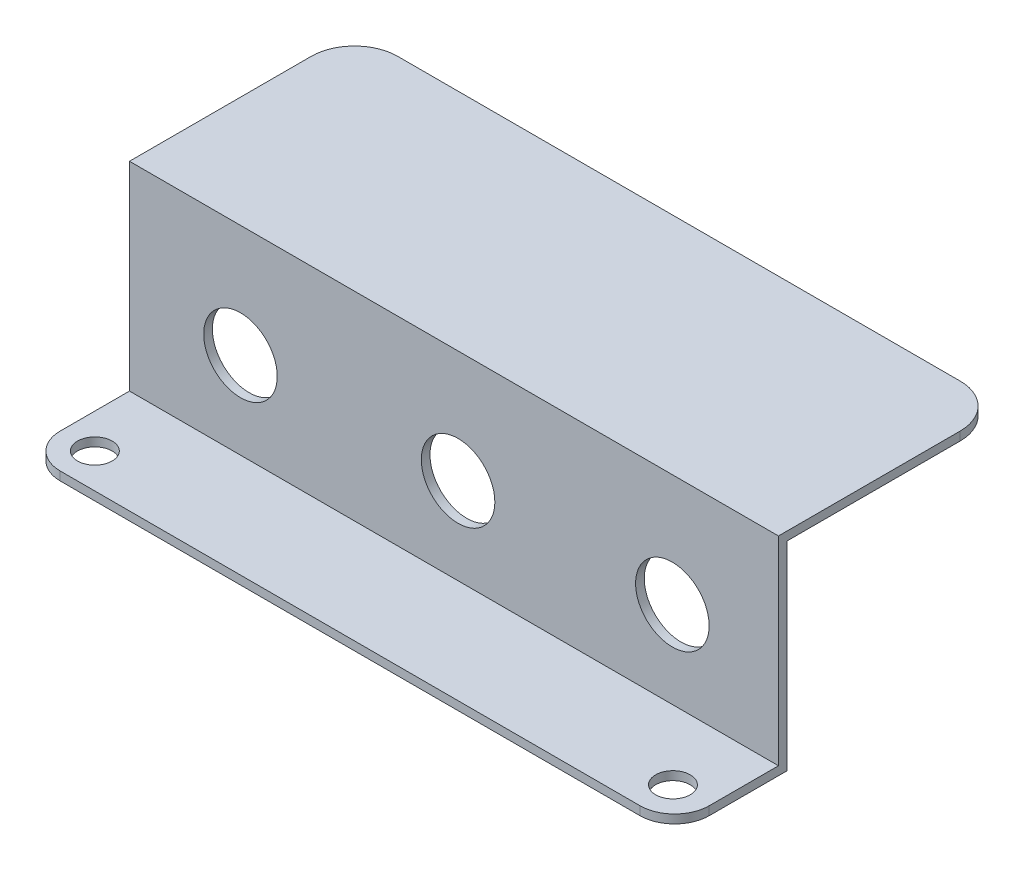
ISO-10303-21;
HEADER;
FILE_DESCRIPTION(('STEP AP214'),'2;1');
FILE_NAME('part.step','',(''),(''),'','','');
FILE_SCHEMA(('AUTOMOTIVE_DESIGN { 1 0 10303 214 1 1 1 1 }'));
ENDSEC;
DATA;
#1=APPLICATION_CONTEXT('core data for automotive mechanical design processes');
#2=APPLICATION_PROTOCOL_DEFINITION('international standard','automotive_design',2000,#1);
#3=PRODUCT_CONTEXT('',#1,'mechanical');
#4=PRODUCT('Part','Part','',(#3));
#5=PRODUCT_RELATED_PRODUCT_CATEGORY('part','',(#4));
#6=PRODUCT_DEFINITION_FORMATION('','',#4);
#7=PRODUCT_DEFINITION_CONTEXT('part definition',#1,'design');
#8=PRODUCT_DEFINITION('design','',#6,#7);
#9=PRODUCT_DEFINITION_SHAPE('','',#8);
#10=(LENGTH_UNIT() NAMED_UNIT(*) SI_UNIT(.MILLI.,.METRE.));
#11=(NAMED_UNIT(*) PLANE_ANGLE_UNIT() SI_UNIT($,.RADIAN.));
#12=(NAMED_UNIT(*) SI_UNIT($,.STERADIAN.) SOLID_ANGLE_UNIT());
#13=UNCERTAINTY_MEASURE_WITH_UNIT(LENGTH_MEASURE(1.E-05),#10,'distance_accuracy_value','');
#14=(GEOMETRIC_REPRESENTATION_CONTEXT(3) GLOBAL_UNCERTAINTY_ASSIGNED_CONTEXT((#13)) GLOBAL_UNIT_ASSIGNED_CONTEXT((#10,
#11,#12)) REPRESENTATION_CONTEXT('',''));
#15=CARTESIAN_POINT('',(0.,0.,0.));
#16=DIRECTION('',(0.,0.,1.));
#17=DIRECTION('',(1.,0.,0.));
#18=AXIS2_PLACEMENT_3D('',#15,#16,#17);
#19=CARTESIAN_POINT('',(0.,0.,16.));
#20=DIRECTION('',(0.,0.,1.));
#21=DIRECTION('',(1.,0.,0.));
#22=AXIS2_PLACEMENT_3D('',#19,#20,#21);
#23=PLANE('',#22);
#24=CARTESIAN_POINT('',(-37.1729743459487,-12.,16.));
#25=DIRECTION('',(0.,0.,1.));
#26=DIRECTION('',(1.,0.,0.));
#27=AXIS2_PLACEMENT_3D('',#24,#25,#26);
#28=CIRCLE('',#27,4.25000000000001);
#29=CARTESIAN_POINT('',(-32.9229743459487,-12.,16.));
#30=VERTEX_POINT('',#29);
#31=EDGE_CURVE('E313',#30,#30,#28,.T.);
#32=ORIENTED_EDGE('',*,*,#31,.F.);
#33=EDGE_LOOP('',(#32));
#34=FACE_BOUND('',#33,.T.);
#35=CARTESIAN_POINT('',(12.7381254762509,-12.,16.));
#36=DIRECTION('',(0.,0.,1.));
#37=DIRECTION('',(1.,0.,0.));
#38=AXIS2_PLACEMENT_3D('',#35,#36,#37);
#39=CIRCLE('',#38,4.25);
#40=CARTESIAN_POINT('',(16.9881254762509,-12.,16.));
#41=VERTEX_POINT('',#40);
#42=EDGE_CURVE('E312',#41,#41,#39,.T.);
#43=ORIENTED_EDGE('',*,*,#42,.F.);
#44=EDGE_LOOP('',(#43));
#45=FACE_BOUND('',#44,.T.);
#46=CARTESIAN_POINT('',(-12.026924053848,-12.,16.));
#47=DIRECTION('',(0.,0.,1.));
#48=DIRECTION('',(1.,0.,0.));
#49=AXIS2_PLACEMENT_3D('',#46,#47,#48);
#50=CIRCLE('',#49,4.25);
#51=CARTESIAN_POINT('',(-7.77692405384802,-12.,16.));
#52=VERTEX_POINT('',#51);
#53=EDGE_CURVE('E305',#52,#52,#50,.T.);
#54=ORIENTED_EDGE('',*,*,#53,.F.);
#55=EDGE_LOOP('',(#54));
#56=FACE_BOUND('',#55,.T.);
#57=DIRECTION('',(0.,-1.,0.));
#58=VECTOR('',#57,1.);
#59=CARTESIAN_POINT('',(-50.,1.,16.));
#60=LINE('',#59,#58);
#61=CARTESIAN_POINT('',(-50.,1.,16.));
#62=VERTEX_POINT('',#61);
#63=CARTESIAN_POINT('',(-50.,-22.,16.));
#64=VERTEX_POINT('',#63);
#65=EDGE_CURVE('E129',#62,#64,#60,.T.);
#66=ORIENTED_EDGE('',*,*,#65,.T.);
#67=DIRECTION('',(1.,0.,0.));
#68=VECTOR('',#67,1.);
#69=CARTESIAN_POINT('',(-50.,-22.,16.));
#70=LINE('',#69,#68);
#71=CARTESIAN_POINT('',(25.,-22.,16.));
#72=VERTEX_POINT('',#71);
#73=EDGE_CURVE('E135',#64,#72,#70,.T.);
#74=ORIENTED_EDGE('',*,*,#73,.T.);
#75=DIRECTION('',(0.,1.,0.));
#76=VECTOR('',#75,1.);
#77=CARTESIAN_POINT('',(25.,1.,16.));
#78=LINE('',#77,#76);
#79=CARTESIAN_POINT('',(25.,1.,16.));
#80=VERTEX_POINT('',#79);
#81=EDGE_CURVE('E148',#72,#80,#78,.T.);
#82=ORIENTED_EDGE('',*,*,#81,.T.);
#83=DIRECTION('',(-1.,0.,0.));
#84=VECTOR('',#83,1.);
#85=CARTESIAN_POINT('',(-50.,1.,16.));
#86=LINE('',#85,#84);
#87=EDGE_CURVE('E147',#80,#62,#86,.T.);
#88=ORIENTED_EDGE('',*,*,#87,.T.);
#89=EDGE_LOOP('',(#66,#74,#82,#88));
#90=FACE_BOUND('',#89,.T.);
#91=ADVANCED_FACE('F33',(#34,#45,#56,#90),#23,.T.);
#92=CARTESIAN_POINT('',(25.,1.,15.));
#93=DIRECTION('',(-1.,0.,0.));
#94=DIRECTION('',(0.,0.,1.));
#95=AXIS2_PLACEMENT_3D('',#92,#93,#94);
#96=PLANE('',#95);
#97=DIRECTION('',(0.,0.,-1.));
#98=VECTOR('',#97,1.);
#99=CARTESIAN_POINT('',(25.,0.,15.));
#100=LINE('',#99,#98);
#101=CARTESIAN_POINT('',(25.,0.,15.));
#102=VERTEX_POINT('',#101);
#103=CARTESIAN_POINT('',(25.,0.,-5.));
#104=VERTEX_POINT('',#103);
#105=EDGE_CURVE('E169',#102,#104,#100,.T.);
#106=ORIENTED_EDGE('',*,*,#105,.T.);
#107=DIRECTION('',(0.,-1.,0.));
#108=VECTOR('',#107,1.);
#109=CARTESIAN_POINT('',(25.,1.,-5.));
#110=LINE('',#109,#108);
#111=CARTESIAN_POINT('',(25.,1.,-5.));
#112=VERTEX_POINT('',#111);
#113=EDGE_CURVE('E56',#104,#112,#110,.F.);
#114=ORIENTED_EDGE('',*,*,#113,.T.);
#115=DIRECTION('',(0.,0.,-1.));
#116=VECTOR('',#115,1.);
#117=CARTESIAN_POINT('',(25.,1.,15.));
#118=LINE('',#117,#116);
#119=EDGE_CURVE('E170',#80,#112,#118,.T.);
#120=ORIENTED_EDGE('',*,*,#119,.F.);
#121=ORIENTED_EDGE('',*,*,#81,.F.);
#122=DIRECTION('',(0.,0.,1.));
#123=VECTOR('',#122,1.);
#124=CARTESIAN_POINT('',(25.,-22.,16.));
#125=LINE('',#124,#123);
#126=CARTESIAN_POINT('',(25.,-22.,24.));
#127=VERTEX_POINT('',#126);
#128=EDGE_CURVE('E141',#72,#127,#125,.T.);
#129=ORIENTED_EDGE('',*,*,#128,.T.);
#130=DIRECTION('',(0.,-1.,0.));
#131=VECTOR('',#130,1.);
#132=CARTESIAN_POINT('',(25.,-23.,24.));
#133=LINE('',#132,#131);
#134=CARTESIAN_POINT('',(25.,-23.,24.));
#135=VERTEX_POINT('',#134);
#136=EDGE_CURVE('E199',#127,#135,#133,.T.);
#137=ORIENTED_EDGE('',*,*,#136,.T.);
#138=DIRECTION('',(0.,0.,-1.));
#139=VECTOR('',#138,1.);
#140=CARTESIAN_POINT('',(25.,-23.,16.));
#141=LINE('',#140,#139);
#142=CARTESIAN_POINT('',(25.,-23.,15.));
#143=VERTEX_POINT('',#142);
#144=EDGE_CURVE('E159',#135,#143,#141,.T.);
#145=ORIENTED_EDGE('',*,*,#144,.T.);
#146=DIRECTION('',(0.,1.,0.));
#147=VECTOR('',#146,1.);
#148=CARTESIAN_POINT('',(25.,1.,15.));
#149=LINE('',#148,#147);
#150=EDGE_CURVE('E149',#143,#102,#149,.T.);
#151=ORIENTED_EDGE('',*,*,#150,.T.);
#152=EDGE_LOOP('',(#106,#114,#120,#121,#129,#137,#145,#151));
#153=FACE_BOUND('',#152,.T.);
#154=ADVANCED_FACE('F225',(#153),#96,.F.);
#155=CARTESIAN_POINT('',(-50.,1.,-10.));
#156=DIRECTION('',(0.,0.,1.));
#157=DIRECTION('',(1.,0.,0.));
#158=AXIS2_PLACEMENT_3D('',#155,#156,#157);
#159=PLANE('',#158);
#160=DIRECTION('',(-1.,0.,0.));
#161=VECTOR('',#160,1.);
#162=CARTESIAN_POINT('',(-50.,1.,-10.));
#163=LINE('',#162,#161);
#164=CARTESIAN_POINT('',(20.,1.,-10.));
#165=VERTEX_POINT('',#164);
#166=CARTESIAN_POINT('',(-45.,1.,-10.));
#167=VERTEX_POINT('',#166);
#168=EDGE_CURVE('E172',#165,#167,#163,.T.);
#169=ORIENTED_EDGE('',*,*,#168,.F.);
#170=DIRECTION('',(0.,-1.,0.));
#171=VECTOR('',#170,1.);
#172=CARTESIAN_POINT('',(20.,1.,-10.));
#173=LINE('',#172,#171);
#174=CARTESIAN_POINT('',(20.,0.,-10.));
#175=VERTEX_POINT('',#174);
#176=EDGE_CURVE('E204',#165,#175,#173,.T.);
#177=ORIENTED_EDGE('',*,*,#176,.T.);
#178=DIRECTION('',(-1.,0.,0.));
#179=VECTOR('',#178,1.);
#180=CARTESIAN_POINT('',(-50.,0.,-10.));
#181=LINE('',#180,#179);
#182=CARTESIAN_POINT('',(-45.,0.,-10.));
#183=VERTEX_POINT('',#182);
#184=EDGE_CURVE('E179',#175,#183,#181,.T.);
#185=ORIENTED_EDGE('',*,*,#184,.T.);
#186=DIRECTION('',(0.,-1.,0.));
#187=VECTOR('',#186,1.);
#188=CARTESIAN_POINT('',(-45.,1.,-10.));
#189=LINE('',#188,#187);
#190=EDGE_CURVE('E202',#183,#167,#189,.F.);
#191=ORIENTED_EDGE('',*,*,#190,.T.);
#192=EDGE_LOOP('',(#169,#177,#185,#191));
#193=FACE_BOUND('',#192,.T.);
#194=ADVANCED_FACE('F218',(#193),#159,.F.);
#195=CARTESIAN_POINT('',(-50.,1.,15.));
#196=DIRECTION('',(1.,0.,0.));
#197=DIRECTION('',(0.,0.,-1.));
#198=AXIS2_PLACEMENT_3D('',#195,#196,#197);
#199=PLANE('',#198);
#200=DIRECTION('',(0.,0.,1.));
#201=VECTOR('',#200,1.);
#202=CARTESIAN_POINT('',(-50.,1.,15.));
#203=LINE('',#202,#201);
#204=CARTESIAN_POINT('',(-50.,1.,-5.));
#205=VERTEX_POINT('',#204);
#206=EDGE_CURVE('E175',#205,#62,#203,.T.);
#207=ORIENTED_EDGE('',*,*,#206,.F.);
#208=DIRECTION('',(0.,-1.,0.));
#209=VECTOR('',#208,1.);
#210=CARTESIAN_POINT('',(-50.,1.,-5.));
#211=LINE('',#210,#209);
#212=CARTESIAN_POINT('',(-50.,0.,-5.));
#213=VERTEX_POINT('',#212);
#214=EDGE_CURVE('E11',#205,#213,#211,.T.);
#215=ORIENTED_EDGE('',*,*,#214,.T.);
#216=DIRECTION('',(0.,0.,1.));
#217=VECTOR('',#216,1.);
#218=CARTESIAN_POINT('',(-50.,0.,15.));
#219=LINE('',#218,#217);
#220=CARTESIAN_POINT('',(-50.,0.,15.));
#221=VERTEX_POINT('',#220);
#222=EDGE_CURVE('E182',#213,#221,#219,.T.);
#223=ORIENTED_EDGE('',*,*,#222,.T.);
#224=DIRECTION('',(0.,-1.,0.));
#225=VECTOR('',#224,1.);
#226=CARTESIAN_POINT('',(-50.,1.,15.));
#227=LINE('',#226,#225);
#228=CARTESIAN_POINT('',(-50.,-23.,15.));
#229=VERTEX_POINT('',#228);
#230=EDGE_CURVE('E160',#221,#229,#227,.T.);
#231=ORIENTED_EDGE('',*,*,#230,.T.);
#232=DIRECTION('',(0.,0.,-1.));
#233=VECTOR('',#232,1.);
#234=CARTESIAN_POINT('',(-50.,-23.,16.));
#235=LINE('',#234,#233);
#236=CARTESIAN_POINT('',(-50.,-23.,24.));
#237=VERTEX_POINT('',#236);
#238=EDGE_CURVE('E167',#237,#229,#235,.T.);
#239=ORIENTED_EDGE('',*,*,#238,.F.);
#240=DIRECTION('',(0.,-1.,0.));
#241=VECTOR('',#240,1.);
#242=CARTESIAN_POINT('',(-50.,-22.,24.));
#243=LINE('',#242,#241);
#244=CARTESIAN_POINT('',(-50.,-22.,24.));
#245=VERTEX_POINT('',#244);
#246=EDGE_CURVE('E132',#237,#245,#243,.F.);
#247=ORIENTED_EDGE('',*,*,#246,.T.);
#248=DIRECTION('',(0.,0.,-1.));
#249=VECTOR('',#248,1.);
#250=CARTESIAN_POINT('',(-50.,-22.,16.));
#251=LINE('',#250,#249);
#252=EDGE_CURVE('E125',#245,#64,#251,.T.);
#253=ORIENTED_EDGE('',*,*,#252,.T.);
#254=ORIENTED_EDGE('',*,*,#65,.F.);
#255=EDGE_LOOP('',(#207,#215,#223,#231,#239,#247,#253,#254));
#256=FACE_BOUND('',#255,.T.);
#257=ADVANCED_FACE('F127',(#256),#199,.F.);
#258=CARTESIAN_POINT('',(0.,1.,0.));
#259=DIRECTION('',(0.,-1.,0.));
#260=DIRECTION('',(0.,0.,-1.));
#261=AXIS2_PLACEMENT_3D('',#258,#259,#260);
#262=PLANE('',#261);
#263=ORIENTED_EDGE('',*,*,#119,.T.);
#264=CARTESIAN_POINT('',(20.,1.,-5.));
#265=DIRECTION('',(0.,-1.,0.));
#266=DIRECTION('',(0.,0.,-1.));
#267=AXIS2_PLACEMENT_3D('',#264,#265,#266);
#268=CIRCLE('',#267,5.);
#269=EDGE_CURVE('E41',#112,#165,#268,.F.);
#270=ORIENTED_EDGE('',*,*,#269,.T.);
#271=ORIENTED_EDGE('',*,*,#168,.T.);
#272=CARTESIAN_POINT('',(-45.,1.,-5.));
#273=DIRECTION('',(0.,-1.,0.));
#274=DIRECTION('',(0.,0.,-1.));
#275=AXIS2_PLACEMENT_3D('',#272,#273,#274);
#276=CIRCLE('',#275,5.);
#277=EDGE_CURVE('E48',#167,#205,#276,.F.);
#278=ORIENTED_EDGE('',*,*,#277,.T.);
#279=ORIENTED_EDGE('',*,*,#206,.T.);
#280=ORIENTED_EDGE('',*,*,#87,.F.);
#281=EDGE_LOOP('',(#263,#270,#271,#278,#279,#280));
#282=FACE_BOUND('',#281,.T.);
#283=ADVANCED_FACE('F214',(#282),#262,.F.);
#284=CARTESIAN_POINT('',(0.,0.,0.));
#285=DIRECTION('',(0.,-1.,0.));
#286=DIRECTION('',(0.,0.,-1.));
#287=AXIS2_PLACEMENT_3D('',#284,#285,#286);
#288=PLANE('',#287);
#289=ORIENTED_EDGE('',*,*,#184,.F.);
#290=CARTESIAN_POINT('',(20.,0.,-5.));
#291=DIRECTION('',(0.,-1.,0.));
#292=DIRECTION('',(0.,0.,-1.));
#293=AXIS2_PLACEMENT_3D('',#290,#291,#292);
#294=CIRCLE('',#293,5.);
#295=EDGE_CURVE('E209',#175,#104,#294,.T.);
#296=ORIENTED_EDGE('',*,*,#295,.T.);
#297=ORIENTED_EDGE('',*,*,#105,.F.);
#298=DIRECTION('',(1.,0.,0.));
#299=VECTOR('',#298,1.);
#300=CARTESIAN_POINT('',(-50.,0.,15.));
#301=LINE('',#300,#299);
#302=EDGE_CURVE('E173',#221,#102,#301,.T.);
#303=ORIENTED_EDGE('',*,*,#302,.F.);
#304=ORIENTED_EDGE('',*,*,#222,.F.);
#305=CARTESIAN_POINT('',(-45.,0.,-5.));
#306=DIRECTION('',(0.,-1.,0.));
#307=DIRECTION('',(0.,0.,-1.));
#308=AXIS2_PLACEMENT_3D('',#305,#306,#307);
#309=CIRCLE('',#308,5.);
#310=EDGE_CURVE('E207',#213,#183,#309,.T.);
#311=ORIENTED_EDGE('',*,*,#310,.T.);
#312=EDGE_LOOP('',(#289,#296,#297,#303,#304,#311));
#313=FACE_BOUND('',#312,.T.);
#314=ADVANCED_FACE('F223',(#313),#288,.T.);
#315=CARTESIAN_POINT('',(0.,0.,15.));
#316=DIRECTION('',(0.,0.,1.));
#317=DIRECTION('',(1.,0.,0.));
#318=AXIS2_PLACEMENT_3D('',#315,#316,#317);
#319=PLANE('',#318);
#320=CARTESIAN_POINT('',(-37.1729743459487,-12.,15.));
#321=DIRECTION('',(0.,0.,1.));
#322=DIRECTION('',(1.,0.,0.));
#323=AXIS2_PLACEMENT_3D('',#320,#321,#322);
#324=CIRCLE('',#323,4.25000000000001);
#325=CARTESIAN_POINT('',(-32.9229743459487,-12.,15.));
#326=VERTEX_POINT('',#325);
#327=EDGE_CURVE('E309',#326,#326,#324,.F.);
#328=ORIENTED_EDGE('',*,*,#327,.F.);
#329=EDGE_LOOP('',(#328));
#330=FACE_BOUND('',#329,.T.);
#331=CARTESIAN_POINT('',(12.7381254762509,-12.,15.));
#332=DIRECTION('',(0.,0.,1.));
#333=DIRECTION('',(1.,0.,0.));
#334=AXIS2_PLACEMENT_3D('',#331,#332,#333);
#335=CIRCLE('',#334,4.25);
#336=CARTESIAN_POINT('',(16.9881254762509,-12.,15.));
#337=VERTEX_POINT('',#336);
#338=EDGE_CURVE('E308',#337,#337,#335,.F.);
#339=ORIENTED_EDGE('',*,*,#338,.F.);
#340=EDGE_LOOP('',(#339));
#341=FACE_BOUND('',#340,.T.);
#342=CARTESIAN_POINT('',(-12.026924053848,-12.,15.));
#343=DIRECTION('',(0.,0.,1.));
#344=DIRECTION('',(1.,0.,0.));
#345=AXIS2_PLACEMENT_3D('',#342,#343,#344);
#346=CIRCLE('',#345,4.25);
#347=CARTESIAN_POINT('',(-7.77692405384802,-12.,15.));
#348=VERTEX_POINT('',#347);
#349=EDGE_CURVE('E300',#348,#348,#346,.F.);
#350=ORIENTED_EDGE('',*,*,#349,.F.);
#351=EDGE_LOOP('',(#350));
#352=FACE_BOUND('',#351,.T.);
#353=ORIENTED_EDGE('',*,*,#230,.F.);
#354=ORIENTED_EDGE('',*,*,#302,.T.);
#355=ORIENTED_EDGE('',*,*,#150,.F.);
#356=DIRECTION('',(1.,0.,0.));
#357=VECTOR('',#356,1.);
#358=CARTESIAN_POINT('',(-50.,-23.,15.));
#359=LINE('',#358,#357);
#360=EDGE_CURVE('E153',#229,#143,#359,.T.);
#361=ORIENTED_EDGE('',*,*,#360,.F.);
#362=EDGE_LOOP('',(#353,#354,#355,#361));
#363=FACE_BOUND('',#362,.T.);
#364=ADVANCED_FACE('F231',(#330,#341,#352,#363),#319,.F.);
#365=CARTESIAN_POINT('',(-50.,-23.,16.));
#366=DIRECTION('',(0.,1.,0.));
#367=DIRECTION('',(0.,0.,1.));
#368=AXIS2_PLACEMENT_3D('',#365,#366,#367);
#369=PLANE('',#368);
#370=DIRECTION('',(-1.,0.,0.));
#371=VECTOR('',#370,1.);
#372=CARTESIAN_POINT('',(-50.,-23.,28.));
#373=LINE('',#372,#371);
#374=CARTESIAN_POINT('',(21.,-23.,28.));
#375=VERTEX_POINT('',#374);
#376=CARTESIAN_POINT('',(-46.,-23.,28.));
#377=VERTEX_POINT('',#376);
#378=EDGE_CURVE('E136',#375,#377,#373,.T.);
#379=ORIENTED_EDGE('',*,*,#378,.T.);
#380=CARTESIAN_POINT('',(-46.,-23.,24.));
#381=DIRECTION('',(0.,1.,0.));
#382=DIRECTION('',(0.,0.,1.));
#383=AXIS2_PLACEMENT_3D('',#380,#381,#382);
#384=CIRCLE('',#383,4.);
#385=EDGE_CURVE('E192',#377,#237,#384,.F.);
#386=ORIENTED_EDGE('',*,*,#385,.T.);
#387=ORIENTED_EDGE('',*,*,#238,.T.);
#388=ORIENTED_EDGE('',*,*,#360,.T.);
#389=ORIENTED_EDGE('',*,*,#144,.F.);
#390=CARTESIAN_POINT('',(21.,-23.,24.));
#391=DIRECTION('',(0.,1.,0.));
#392=DIRECTION('',(0.,0.,1.));
#393=AXIS2_PLACEMENT_3D('',#390,#391,#392);
#394=CIRCLE('',#393,4.);
#395=EDGE_CURVE('E190',#135,#375,#394,.F.);
#396=ORIENTED_EDGE('',*,*,#395,.T.);
#397=EDGE_LOOP('',(#379,#386,#387,#388,#389,#396));
#398=FACE_BOUND('',#397,.T.);
#399=CARTESIAN_POINT('',(-46.,-23.,24.));
#400=DIRECTION('',(0.,-1.,0.));
#401=DIRECTION('',(0.,0.,-1.));
#402=AXIS2_PLACEMENT_3D('',#399,#400,#401);
#403=CIRCLE('',#402,2.);
#404=CARTESIAN_POINT('',(-46.,-23.,22.));
#405=VERTEX_POINT('',#404);
#406=EDGE_CURVE('E297',#405,#405,#403,.T.);
#407=ORIENTED_EDGE('',*,*,#406,.F.);
#408=EDGE_LOOP('',(#407));
#409=FACE_BOUND('',#408,.T.);
#410=CARTESIAN_POINT('',(20.8058586177985,-23.,24.));
#411=DIRECTION('',(0.,-1.,0.));
#412=DIRECTION('',(0.,0.,-1.));
#413=AXIS2_PLACEMENT_3D('',#410,#411,#412);
#414=CIRCLE('',#413,2.00000000000001);
#415=CARTESIAN_POINT('',(20.8058586177985,-23.,22.));
#416=VERTEX_POINT('',#415);
#417=EDGE_CURVE('E290',#416,#416,#414,.T.);
#418=ORIENTED_EDGE('',*,*,#417,.F.);
#419=EDGE_LOOP('',(#418));
#420=FACE_BOUND('',#419,.T.);
#421=ADVANCED_FACE('F255',(#398,#409,#420),#369,.F.);
#422=CARTESIAN_POINT('',(-50.,-22.,28.));
#423=DIRECTION('',(0.,0.,1.));
#424=DIRECTION('',(1.,0.,0.));
#425=AXIS2_PLACEMENT_3D('',#422,#423,#424);
#426=PLANE('',#425);
#427=DIRECTION('',(-1.,0.,0.));
#428=VECTOR('',#427,1.);
#429=CARTESIAN_POINT('',(-50.,-22.,28.));
#430=LINE('',#429,#428);
#431=CARTESIAN_POINT('',(21.,-22.,28.));
#432=VERTEX_POINT('',#431);
#433=CARTESIAN_POINT('',(-46.,-22.,28.));
#434=VERTEX_POINT('',#433);
#435=EDGE_CURVE('E163',#432,#434,#430,.T.);
#436=ORIENTED_EDGE('',*,*,#435,.T.);
#437=DIRECTION('',(0.,-1.,0.));
#438=VECTOR('',#437,1.);
#439=CARTESIAN_POINT('',(-46.,-23.,28.));
#440=LINE('',#439,#438);
#441=EDGE_CURVE('E187',#434,#377,#440,.T.);
#442=ORIENTED_EDGE('',*,*,#441,.T.);
#443=ORIENTED_EDGE('',*,*,#378,.F.);
#444=DIRECTION('',(0.,-1.,0.));
#445=VECTOR('',#444,1.);
#446=CARTESIAN_POINT('',(21.,-22.,28.));
#447=LINE('',#446,#445);
#448=EDGE_CURVE('E177',#375,#432,#447,.F.);
#449=ORIENTED_EDGE('',*,*,#448,.T.);
#450=EDGE_LOOP('',(#436,#442,#443,#449));
#451=FACE_BOUND('',#450,.T.);
#452=ADVANCED_FACE('F251',(#451),#426,.T.);
#453=CARTESIAN_POINT('',(0.,-22.,0.));
#454=DIRECTION('',(0.,1.,0.));
#455=DIRECTION('',(0.,0.,1.));
#456=AXIS2_PLACEMENT_3D('',#453,#454,#455);
#457=PLANE('',#456);
#458=CARTESIAN_POINT('',(-46.,-22.,24.));
#459=DIRECTION('',(0.,-1.,0.));
#460=DIRECTION('',(0.,0.,-1.));
#461=AXIS2_PLACEMENT_3D('',#458,#459,#460);
#462=CIRCLE('',#461,2.);
#463=CARTESIAN_POINT('',(-46.,-22.,22.));
#464=VERTEX_POINT('',#463);
#465=EDGE_CURVE('E294',#464,#464,#462,.T.);
#466=ORIENTED_EDGE('',*,*,#465,.T.);
#467=EDGE_LOOP('',(#466));
#468=FACE_BOUND('',#467,.T.);
#469=CARTESIAN_POINT('',(20.8058586177985,-22.,24.));
#470=DIRECTION('',(0.,-1.,0.));
#471=DIRECTION('',(0.,0.,-1.));
#472=AXIS2_PLACEMENT_3D('',#469,#470,#471);
#473=CIRCLE('',#472,2.00000000000001);
#474=CARTESIAN_POINT('',(20.8058586177985,-22.,22.));
#475=VERTEX_POINT('',#474);
#476=EDGE_CURVE('E293',#475,#475,#473,.T.);
#477=ORIENTED_EDGE('',*,*,#476,.T.);
#478=EDGE_LOOP('',(#477));
#479=FACE_BOUND('',#478,.T.);
#480=ORIENTED_EDGE('',*,*,#252,.F.);
#481=CARTESIAN_POINT('',(-46.,-22.,24.));
#482=DIRECTION('',(0.,1.,0.));
#483=DIRECTION('',(0.,0.,1.));
#484=AXIS2_PLACEMENT_3D('',#481,#482,#483);
#485=CIRCLE('',#484,4.);
#486=EDGE_CURVE('E197',#245,#434,#485,.T.);
#487=ORIENTED_EDGE('',*,*,#486,.T.);
#488=ORIENTED_EDGE('',*,*,#435,.F.);
#489=CARTESIAN_POINT('',(21.,-22.,24.));
#490=DIRECTION('',(0.,1.,0.));
#491=DIRECTION('',(0.,0.,1.));
#492=AXIS2_PLACEMENT_3D('',#489,#490,#491);
#493=CIRCLE('',#492,4.);
#494=EDGE_CURVE('E195',#432,#127,#493,.T.);
#495=ORIENTED_EDGE('',*,*,#494,.T.);
#496=ORIENTED_EDGE('',*,*,#128,.F.);
#497=ORIENTED_EDGE('',*,*,#73,.F.);
#498=EDGE_LOOP('',(#480,#487,#488,#495,#496,#497));
#499=FACE_BOUND('',#498,.T.);
#500=ADVANCED_FACE('F139',(#468,#479,#499),#457,.T.);
#501=CARTESIAN_POINT('',(20.8058586177985,-22.,24.));
#502=DIRECTION('',(0.,-1.,0.));
#503=DIRECTION('',(0.,0.,-1.));
#504=AXIS2_PLACEMENT_3D('',#501,#502,#503);
#505=CYLINDRICAL_SURFACE('',#504,2.00000000000001);
#506=ORIENTED_EDGE('',*,*,#476,.F.);
#507=EDGE_LOOP('',(#506));
#508=FACE_BOUND('',#507,.T.);
#509=ORIENTED_EDGE('',*,*,#417,.T.);
#510=EDGE_LOOP('',(#509));
#511=FACE_BOUND('',#510,.T.);
#512=ADVANCED_FACE('F339',(#508,#511),#505,.F.);
#513=CARTESIAN_POINT('',(-46.,-22.,24.));
#514=DIRECTION('',(0.,-1.,0.));
#515=DIRECTION('',(0.,0.,-1.));
#516=AXIS2_PLACEMENT_3D('',#513,#514,#515);
#517=CYLINDRICAL_SURFACE('',#516,2.);
#518=ORIENTED_EDGE('',*,*,#465,.F.);
#519=EDGE_LOOP('',(#518));
#520=FACE_BOUND('',#519,.T.);
#521=ORIENTED_EDGE('',*,*,#406,.T.);
#522=EDGE_LOOP('',(#521));
#523=FACE_BOUND('',#522,.T.);
#524=ADVANCED_FACE('F272',(#520,#523),#517,.F.);
#525=CARTESIAN_POINT('',(-46.,-22.,24.));
#526=DIRECTION('',(0.,1.,0.));
#527=DIRECTION('',(0.,0.,1.));
#528=AXIS2_PLACEMENT_3D('',#525,#526,#527);
#529=CYLINDRICAL_SURFACE('',#528,4.);
#530=ORIENTED_EDGE('',*,*,#486,.F.);
#531=ORIENTED_EDGE('',*,*,#246,.F.);
#532=ORIENTED_EDGE('',*,*,#385,.F.);
#533=ORIENTED_EDGE('',*,*,#441,.F.);
#534=EDGE_LOOP('',(#530,#531,#532,#533));
#535=FACE_BOUND('',#534,.T.);
#536=ADVANCED_FACE('F268',(#535),#529,.T.);
#537=CARTESIAN_POINT('',(21.,1.,24.));
#538=DIRECTION('',(0.,1.,0.));
#539=DIRECTION('',(0.,0.,1.));
#540=AXIS2_PLACEMENT_3D('',#537,#538,#539);
#541=CYLINDRICAL_SURFACE('',#540,4.);
#542=ORIENTED_EDGE('',*,*,#494,.F.);
#543=ORIENTED_EDGE('',*,*,#448,.F.);
#544=ORIENTED_EDGE('',*,*,#395,.F.);
#545=ORIENTED_EDGE('',*,*,#136,.F.);
#546=EDGE_LOOP('',(#542,#543,#544,#545));
#547=FACE_BOUND('',#546,.T.);
#548=ADVANCED_FACE('F271',(#547),#541,.T.);
#549=CARTESIAN_POINT('',(-12.026924053848,-12.,-10.001));
#550=DIRECTION('',(0.,0.,1.));
#551=DIRECTION('',(1.,0.,0.));
#552=AXIS2_PLACEMENT_3D('',#549,#550,#551);
#553=CYLINDRICAL_SURFACE('',#552,4.25);
#554=CARTESIAN_POINT('',(-7.77692405384802,-12.,16.));
#555=CARTESIAN_POINT('',(-7.77692405384802,-12.,15.9895833333333));
#556=CARTESIAN_POINT('',(-7.77692405384802,-12.,15.9791666666667));
#557=CARTESIAN_POINT('',(-7.77692405384802,-12.,15.9583333333333));
#558=CARTESIAN_POINT('',(-7.77692405384802,-12.,15.9479166666667));
#559=CARTESIAN_POINT('',(-7.77692405384802,-12.,15.9270833333333));
#560=CARTESIAN_POINT('',(-7.77692405384802,-12.,15.9166666666667));
#561=CARTESIAN_POINT('',(-7.77692405384802,-12.,15.8958333333333));
#562=CARTESIAN_POINT('',(-7.77692405384802,-12.,15.8854166666667));
#563=CARTESIAN_POINT('',(-7.77692405384802,-12.,15.8645833333333));
#564=CARTESIAN_POINT('',(-7.77692405384802,-12.,15.8541666666667));
#565=CARTESIAN_POINT('',(-7.77692405384802,-12.,15.8333333333333));
#566=CARTESIAN_POINT('',(-7.77692405384802,-12.,15.8229166666667));
#567=CARTESIAN_POINT('',(-7.77692405384802,-12.,15.8020833333333));
#568=CARTESIAN_POINT('',(-7.77692405384802,-12.,15.7916666666667));
#569=CARTESIAN_POINT('',(-7.77692405384802,-12.,15.7708333333333));
#570=CARTESIAN_POINT('',(-7.77692405384802,-12.,15.7604166666667));
#571=CARTESIAN_POINT('',(-7.77692405384802,-12.,15.7395833333333));
#572=CARTESIAN_POINT('',(-7.77692405384802,-12.,15.7291666666667));
#573=CARTESIAN_POINT('',(-7.77692405384802,-12.,15.7083333333333));
#574=CARTESIAN_POINT('',(-7.77692405384802,-12.,15.6979166666667));
#575=CARTESIAN_POINT('',(-7.77692405384802,-12.,15.6770833333333));
#576=CARTESIAN_POINT('',(-7.77692405384802,-12.,15.6666666666667));
#577=CARTESIAN_POINT('',(-7.77692405384802,-12.,15.6458333333333));
#578=CARTESIAN_POINT('',(-7.77692405384802,-12.,15.6354166666667));
#579=CARTESIAN_POINT('',(-7.77692405384802,-12.,15.6145833333333));
#580=CARTESIAN_POINT('',(-7.77692405384802,-12.,15.6041666666667));
#581=CARTESIAN_POINT('',(-7.77692405384802,-12.,15.5833333333333));
#582=CARTESIAN_POINT('',(-7.77692405384802,-12.,15.5729166666667));
#583=CARTESIAN_POINT('',(-7.77692405384802,-12.,15.5520833333333));
#584=CARTESIAN_POINT('',(-7.77692405384802,-12.,15.5416666666667));
#585=CARTESIAN_POINT('',(-7.77692405384802,-12.,15.5208333333333));
#586=CARTESIAN_POINT('',(-7.77692405384802,-12.,15.5104166666667));
#587=CARTESIAN_POINT('',(-7.77692405384802,-12.,15.4895833333333));
#588=CARTESIAN_POINT('',(-7.77692405384802,-12.,15.4791666666667));
#589=CARTESIAN_POINT('',(-7.77692405384802,-12.,15.4583333333333));
#590=CARTESIAN_POINT('',(-7.77692405384802,-12.,15.4479166666667));
#591=CARTESIAN_POINT('',(-7.77692405384802,-12.,15.4270833333333));
#592=CARTESIAN_POINT('',(-7.77692405384802,-12.,15.4166666666667));
#593=CARTESIAN_POINT('',(-7.77692405384802,-12.,15.3958333333333));
#594=CARTESIAN_POINT('',(-7.77692405384802,-12.,15.3854166666667));
#595=CARTESIAN_POINT('',(-7.77692405384802,-12.,15.3645833333333));
#596=CARTESIAN_POINT('',(-7.77692405384802,-12.,15.3541666666667));
#597=CARTESIAN_POINT('',(-7.77692405384802,-12.,15.3333333333333));
#598=CARTESIAN_POINT('',(-7.77692405384802,-12.,15.3229166666667));
#599=CARTESIAN_POINT('',(-7.77692405384802,-12.,15.3020833333333));
#600=CARTESIAN_POINT('',(-7.77692405384802,-12.,15.2916666666667));
#601=CARTESIAN_POINT('',(-7.77692405384802,-12.,15.2708333333333));
#602=CARTESIAN_POINT('',(-7.77692405384802,-12.,15.2604166666667));
#603=CARTESIAN_POINT('',(-7.77692405384802,-12.,15.2395833333333));
#604=CARTESIAN_POINT('',(-7.77692405384802,-12.,15.2291666666667));
#605=CARTESIAN_POINT('',(-7.77692405384802,-12.,15.2083333333333));
#606=CARTESIAN_POINT('',(-7.77692405384802,-12.,15.1979166666667));
#607=CARTESIAN_POINT('',(-7.77692405384802,-12.,15.1770833333333));
#608=CARTESIAN_POINT('',(-7.77692405384802,-12.,15.1666666666667));
#609=CARTESIAN_POINT('',(-7.77692405384802,-12.,15.1458333333333));
#610=CARTESIAN_POINT('',(-7.77692405384802,-12.,15.1354166666667));
#611=CARTESIAN_POINT('',(-7.77692405384802,-12.,15.1145833333333));
#612=CARTESIAN_POINT('',(-7.77692405384802,-12.,15.1041666666667));
#613=CARTESIAN_POINT('',(-7.77692405384802,-12.,15.0833333333333));
#614=CARTESIAN_POINT('',(-7.77692405384802,-12.,15.0729166666667));
#615=CARTESIAN_POINT('',(-7.77692405384802,-12.,15.0520833333333));
#616=CARTESIAN_POINT('',(-7.77692405384802,-12.,15.0416666666667));
#617=CARTESIAN_POINT('',(-7.77692405384802,-12.,15.0208333333333));
#618=CARTESIAN_POINT('',(-7.77692405384802,-12.,15.0104166666667));
#619=CARTESIAN_POINT('',(-7.77692405384802,-12.,15.));
#620=B_SPLINE_CURVE_WITH_KNOTS('',3,(#554,#555,#556,#557,#558,#559,#560,#561,#562,#563,#564,
#565,#566,#567,#568,#569,#570,#571,#572,#573,#574,#575,#576,#577,#578,#579,#580,#581,#582,#583,
#584,#585,#586,#587,#588,#589,#590,#591,#592,#593,#594,#595,#596,#597,#598,#599,#600,#601,#602,
#603,#604,#605,#606,#607,#608,#609,#610,#611,#612,#613,#614,#615,#616,#617,#618,#619),
.UNSPECIFIED.,.F.,.F.,(4,2,2,2,2,2,2,2,2,2,2,2,2,2,2,2,2,2,2,2,2,2,2,2,2,2,2,2,2,2,2,2,4),(0.,
0.03125,0.0625000000000001,0.0937500000000001,0.125,0.15625,0.1875,0.21875,0.25,0.28125,0.3125,
0.34375,0.375,0.40625,0.4375,0.46875,0.5,0.53125,0.5625,0.593750000000001,0.625000000000001,
0.656250000000001,0.687500000000001,0.718750000000001,0.750000000000001,0.781250000000001,
0.812500000000001,0.843750000000001,0.875000000000001,0.906250000000001,0.937500000000001,
0.968750000000001,1.),.UNSPECIFIED.);
#621=EDGE_CURVE('BSEAM275',#52,#348,#620,.T.);
#622=ORIENTED_EDGE('',*,*,#53,.T.);
#623=ORIENTED_EDGE('',*,*,#349,.T.);
#624=ORIENTED_EDGE('',*,*,#621,.T.);
#625=ORIENTED_EDGE('',*,*,#621,.F.);
#626=EDGE_LOOP('',(#622,#624,#623,#625));
#627=FACE_BOUND('',#626,.T.);
#628=ADVANCED_FACE('F275',(#627),#553,.F.);
#629=CARTESIAN_POINT('',(12.7381254762509,-12.,-10.001));
#630=DIRECTION('',(0.,0.,1.));
#631=DIRECTION('',(1.,0.,0.));
#632=AXIS2_PLACEMENT_3D('',#629,#630,#631);
#633=CYLINDRICAL_SURFACE('',#632,4.25);
#634=CARTESIAN_POINT('',(16.9881254762509,-12.,16.));
#635=CARTESIAN_POINT('',(16.9881254762509,-12.,15.9895833333333));
#636=CARTESIAN_POINT('',(16.9881254762509,-12.,15.9791666666667));
#637=CARTESIAN_POINT('',(16.9881254762509,-12.,15.9583333333333));
#638=CARTESIAN_POINT('',(16.9881254762509,-12.,15.9479166666667));
#639=CARTESIAN_POINT('',(16.9881254762509,-12.,15.9270833333333));
#640=CARTESIAN_POINT('',(16.9881254762509,-12.,15.9166666666667));
#641=CARTESIAN_POINT('',(16.9881254762509,-12.,15.8958333333333));
#642=CARTESIAN_POINT('',(16.9881254762509,-12.,15.8854166666667));
#643=CARTESIAN_POINT('',(16.9881254762509,-12.,15.8645833333333));
#644=CARTESIAN_POINT('',(16.9881254762509,-12.,15.8541666666667));
#645=CARTESIAN_POINT('',(16.9881254762509,-12.,15.8333333333333));
#646=CARTESIAN_POINT('',(16.9881254762509,-12.,15.8229166666667));
#647=CARTESIAN_POINT('',(16.9881254762509,-12.,15.8020833333333));
#648=CARTESIAN_POINT('',(16.9881254762509,-12.,15.7916666666667));
#649=CARTESIAN_POINT('',(16.9881254762509,-12.,15.7708333333333));
#650=CARTESIAN_POINT('',(16.9881254762509,-12.,15.7604166666667));
#651=CARTESIAN_POINT('',(16.9881254762509,-12.,15.7395833333333));
#652=CARTESIAN_POINT('',(16.9881254762509,-12.,15.7291666666667));
#653=CARTESIAN_POINT('',(16.9881254762509,-12.,15.7083333333333));
#654=CARTESIAN_POINT('',(16.9881254762509,-12.,15.6979166666667));
#655=CARTESIAN_POINT('',(16.9881254762509,-12.,15.6770833333333));
#656=CARTESIAN_POINT('',(16.9881254762509,-12.,15.6666666666667));
#657=CARTESIAN_POINT('',(16.9881254762509,-12.,15.6458333333333));
#658=CARTESIAN_POINT('',(16.9881254762509,-12.,15.6354166666667));
#659=CARTESIAN_POINT('',(16.9881254762509,-12.,15.6145833333333));
#660=CARTESIAN_POINT('',(16.9881254762509,-12.,15.6041666666667));
#661=CARTESIAN_POINT('',(16.9881254762509,-12.,15.5833333333333));
#662=CARTESIAN_POINT('',(16.9881254762509,-12.,15.5729166666667));
#663=CARTESIAN_POINT('',(16.9881254762509,-12.,15.5520833333333));
#664=CARTESIAN_POINT('',(16.9881254762509,-12.,15.5416666666667));
#665=CARTESIAN_POINT('',(16.9881254762509,-12.,15.5208333333333));
#666=CARTESIAN_POINT('',(16.9881254762509,-12.,15.5104166666667));
#667=CARTESIAN_POINT('',(16.9881254762509,-12.,15.4895833333333));
#668=CARTESIAN_POINT('',(16.9881254762509,-12.,15.4791666666667));
#669=CARTESIAN_POINT('',(16.9881254762509,-12.,15.4583333333333));
#670=CARTESIAN_POINT('',(16.9881254762509,-12.,15.4479166666667));
#671=CARTESIAN_POINT('',(16.9881254762509,-12.,15.4270833333333));
#672=CARTESIAN_POINT('',(16.9881254762509,-12.,15.4166666666667));
#673=CARTESIAN_POINT('',(16.9881254762509,-12.,15.3958333333333));
#674=CARTESIAN_POINT('',(16.9881254762509,-12.,15.3854166666667));
#675=CARTESIAN_POINT('',(16.9881254762509,-12.,15.3645833333333));
#676=CARTESIAN_POINT('',(16.9881254762509,-12.,15.3541666666667));
#677=CARTESIAN_POINT('',(16.9881254762509,-12.,15.3333333333333));
#678=CARTESIAN_POINT('',(16.9881254762509,-12.,15.3229166666667));
#679=CARTESIAN_POINT('',(16.9881254762509,-12.,15.3020833333333));
#680=CARTESIAN_POINT('',(16.9881254762509,-12.,15.2916666666667));
#681=CARTESIAN_POINT('',(16.9881254762509,-12.,15.2708333333333));
#682=CARTESIAN_POINT('',(16.9881254762509,-12.,15.2604166666667));
#683=CARTESIAN_POINT('',(16.9881254762509,-12.,15.2395833333333));
#684=CARTESIAN_POINT('',(16.9881254762509,-12.,15.2291666666667));
#685=CARTESIAN_POINT('',(16.9881254762509,-12.,15.2083333333333));
#686=CARTESIAN_POINT('',(16.9881254762509,-12.,15.1979166666667));
#687=CARTESIAN_POINT('',(16.9881254762509,-12.,15.1770833333333));
#688=CARTESIAN_POINT('',(16.9881254762509,-12.,15.1666666666667));
#689=CARTESIAN_POINT('',(16.9881254762509,-12.,15.1458333333333));
#690=CARTESIAN_POINT('',(16.9881254762509,-12.,15.1354166666667));
#691=CARTESIAN_POINT('',(16.9881254762509,-12.,15.1145833333333));
#692=CARTESIAN_POINT('',(16.9881254762509,-12.,15.1041666666667));
#693=CARTESIAN_POINT('',(16.9881254762509,-12.,15.0833333333333));
#694=CARTESIAN_POINT('',(16.9881254762509,-12.,15.0729166666667));
#695=CARTESIAN_POINT('',(16.9881254762509,-12.,15.0520833333333));
#696=CARTESIAN_POINT('',(16.9881254762509,-12.,15.0416666666667));
#697=CARTESIAN_POINT('',(16.9881254762509,-12.,15.0208333333333));
#698=CARTESIAN_POINT('',(16.9881254762509,-12.,15.0104166666667));
#699=CARTESIAN_POINT('',(16.9881254762509,-12.,15.));
#700=B_SPLINE_CURVE_WITH_KNOTS('',3,(#634,#635,#636,#637,#638,#639,#640,#641,#642,#643,#644,
#645,#646,#647,#648,#649,#650,#651,#652,#653,#654,#655,#656,#657,#658,#659,#660,#661,#662,#663,
#664,#665,#666,#667,#668,#669,#670,#671,#672,#673,#674,#675,#676,#677,#678,#679,#680,#681,#682,
#683,#684,#685,#686,#687,#688,#689,#690,#691,#692,#693,#694,#695,#696,#697,#698,#699),
.UNSPECIFIED.,.F.,.F.,(4,2,2,2,2,2,2,2,2,2,2,2,2,2,2,2,2,2,2,2,2,2,2,2,2,2,2,2,2,2,2,2,4),(0.,
0.03125,0.0625000000000001,0.0937500000000001,0.125,0.15625,0.1875,0.21875,0.25,0.28125,0.3125,
0.34375,0.375,0.40625,0.4375,0.46875,0.5,0.53125,0.5625,0.593750000000001,0.625000000000001,
0.656250000000001,0.687500000000001,0.718750000000001,0.750000000000001,0.781250000000001,
0.812500000000001,0.843750000000001,0.875000000000001,0.906250000000001,0.937500000000001,
0.968750000000001,1.),.UNSPECIFIED.);
#701=EDGE_CURVE('BSEAM280',#41,#337,#700,.T.);
#702=ORIENTED_EDGE('',*,*,#42,.T.);
#703=ORIENTED_EDGE('',*,*,#338,.T.);
#704=ORIENTED_EDGE('',*,*,#701,.T.);
#705=ORIENTED_EDGE('',*,*,#701,.F.);
#706=EDGE_LOOP('',(#702,#704,#703,#705));
#707=FACE_BOUND('',#706,.T.);
#708=ADVANCED_FACE('F280',(#707),#633,.F.);
#709=CARTESIAN_POINT('',(-37.1729743459487,-12.,-10.001));
#710=DIRECTION('',(0.,0.,1.));
#711=DIRECTION('',(1.,0.,0.));
#712=AXIS2_PLACEMENT_3D('',#709,#710,#711);
#713=CYLINDRICAL_SURFACE('',#712,4.25000000000001);
#714=CARTESIAN_POINT('',(-32.9229743459487,-12.,16.));
#715=CARTESIAN_POINT('',(-32.9229743459487,-12.,15.9895833333333));
#716=CARTESIAN_POINT('',(-32.9229743459487,-12.,15.9791666666667));
#717=CARTESIAN_POINT('',(-32.9229743459487,-12.,15.9583333333333));
#718=CARTESIAN_POINT('',(-32.9229743459487,-12.,15.9479166666667));
#719=CARTESIAN_POINT('',(-32.9229743459487,-12.,15.9270833333333));
#720=CARTESIAN_POINT('',(-32.9229743459487,-12.,15.9166666666667));
#721=CARTESIAN_POINT('',(-32.9229743459487,-12.,15.8958333333333));
#722=CARTESIAN_POINT('',(-32.9229743459487,-12.,15.8854166666667));
#723=CARTESIAN_POINT('',(-32.9229743459487,-12.,15.8645833333333));
#724=CARTESIAN_POINT('',(-32.9229743459487,-12.,15.8541666666667));
#725=CARTESIAN_POINT('',(-32.9229743459487,-12.,15.8333333333333));
#726=CARTESIAN_POINT('',(-32.9229743459487,-12.,15.8229166666667));
#727=CARTESIAN_POINT('',(-32.9229743459487,-12.,15.8020833333333));
#728=CARTESIAN_POINT('',(-32.9229743459487,-12.,15.7916666666667));
#729=CARTESIAN_POINT('',(-32.9229743459487,-12.,15.7708333333333));
#730=CARTESIAN_POINT('',(-32.9229743459487,-12.,15.7604166666667));
#731=CARTESIAN_POINT('',(-32.9229743459487,-12.,15.7395833333333));
#732=CARTESIAN_POINT('',(-32.9229743459487,-12.,15.7291666666667));
#733=CARTESIAN_POINT('',(-32.9229743459487,-12.,15.7083333333333));
#734=CARTESIAN_POINT('',(-32.9229743459487,-12.,15.6979166666667));
#735=CARTESIAN_POINT('',(-32.9229743459487,-12.,15.6770833333333));
#736=CARTESIAN_POINT('',(-32.9229743459487,-12.,15.6666666666667));
#737=CARTESIAN_POINT('',(-32.9229743459487,-12.,15.6458333333333));
#738=CARTESIAN_POINT('',(-32.9229743459487,-12.,15.6354166666667));
#739=CARTESIAN_POINT('',(-32.9229743459487,-12.,15.6145833333333));
#740=CARTESIAN_POINT('',(-32.9229743459487,-12.,15.6041666666667));
#741=CARTESIAN_POINT('',(-32.9229743459487,-12.,15.5833333333333));
#742=CARTESIAN_POINT('',(-32.9229743459487,-12.,15.5729166666667));
#743=CARTESIAN_POINT('',(-32.9229743459487,-12.,15.5520833333333));
#744=CARTESIAN_POINT('',(-32.9229743459487,-12.,15.5416666666667));
#745=CARTESIAN_POINT('',(-32.9229743459487,-12.,15.5208333333333));
#746=CARTESIAN_POINT('',(-32.9229743459487,-12.,15.5104166666667));
#747=CARTESIAN_POINT('',(-32.9229743459487,-12.,15.4895833333333));
#748=CARTESIAN_POINT('',(-32.9229743459487,-12.,15.4791666666667));
#749=CARTESIAN_POINT('',(-32.9229743459487,-12.,15.4583333333333));
#750=CARTESIAN_POINT('',(-32.9229743459487,-12.,15.4479166666667));
#751=CARTESIAN_POINT('',(-32.9229743459487,-12.,15.4270833333333));
#752=CARTESIAN_POINT('',(-32.9229743459487,-12.,15.4166666666667));
#753=CARTESIAN_POINT('',(-32.9229743459487,-12.,15.3958333333333));
#754=CARTESIAN_POINT('',(-32.9229743459487,-12.,15.3854166666667));
#755=CARTESIAN_POINT('',(-32.9229743459487,-12.,15.3645833333333));
#756=CARTESIAN_POINT('',(-32.9229743459487,-12.,15.3541666666667));
#757=CARTESIAN_POINT('',(-32.9229743459487,-12.,15.3333333333333));
#758=CARTESIAN_POINT('',(-32.9229743459487,-12.,15.3229166666667));
#759=CARTESIAN_POINT('',(-32.9229743459487,-12.,15.3020833333333));
#760=CARTESIAN_POINT('',(-32.9229743459487,-12.,15.2916666666667));
#761=CARTESIAN_POINT('',(-32.9229743459487,-12.,15.2708333333333));
#762=CARTESIAN_POINT('',(-32.9229743459487,-12.,15.2604166666667));
#763=CARTESIAN_POINT('',(-32.9229743459487,-12.,15.2395833333333));
#764=CARTESIAN_POINT('',(-32.9229743459487,-12.,15.2291666666667));
#765=CARTESIAN_POINT('',(-32.9229743459487,-12.,15.2083333333333));
#766=CARTESIAN_POINT('',(-32.9229743459487,-12.,15.1979166666667));
#767=CARTESIAN_POINT('',(-32.9229743459487,-12.,15.1770833333333));
#768=CARTESIAN_POINT('',(-32.9229743459487,-12.,15.1666666666667));
#769=CARTESIAN_POINT('',(-32.9229743459487,-12.,15.1458333333333));
#770=CARTESIAN_POINT('',(-32.9229743459487,-12.,15.1354166666667));
#771=CARTESIAN_POINT('',(-32.9229743459487,-12.,15.1145833333333));
#772=CARTESIAN_POINT('',(-32.9229743459487,-12.,15.1041666666667));
#773=CARTESIAN_POINT('',(-32.9229743459487,-12.,15.0833333333333));
#774=CARTESIAN_POINT('',(-32.9229743459487,-12.,15.0729166666667));
#775=CARTESIAN_POINT('',(-32.9229743459487,-12.,15.0520833333333));
#776=CARTESIAN_POINT('',(-32.9229743459487,-12.,15.0416666666667));
#777=CARTESIAN_POINT('',(-32.9229743459487,-12.,15.0208333333333));
#778=CARTESIAN_POINT('',(-32.9229743459487,-12.,15.0104166666667));
#779=CARTESIAN_POINT('',(-32.9229743459487,-12.,15.));
#780=B_SPLINE_CURVE_WITH_KNOTS('',3,(#714,#715,#716,#717,#718,#719,#720,#721,#722,#723,#724,
#725,#726,#727,#728,#729,#730,#731,#732,#733,#734,#735,#736,#737,#738,#739,#740,#741,#742,#743,
#744,#745,#746,#747,#748,#749,#750,#751,#752,#753,#754,#755,#756,#757,#758,#759,#760,#761,#762,
#763,#764,#765,#766,#767,#768,#769,#770,#771,#772,#773,#774,#775,#776,#777,#778,#779),
.UNSPECIFIED.,.F.,.F.,(4,2,2,2,2,2,2,2,2,2,2,2,2,2,2,2,2,2,2,2,2,2,2,2,2,2,2,2,2,2,2,2,4),(0.,
0.03125,0.0625000000000001,0.0937500000000001,0.125,0.15625,0.1875,0.21875,0.25,0.28125,0.3125,
0.34375,0.375,0.40625,0.4375,0.46875,0.5,0.53125,0.5625,0.593750000000001,0.625000000000001,
0.656250000000001,0.687500000000001,0.718750000000001,0.750000000000001,0.781250000000001,
0.812500000000001,0.843750000000001,0.875000000000001,0.906250000000001,0.937500000000001,
0.968750000000001,1.),.UNSPECIFIED.);
#781=EDGE_CURVE('BSEAM239',#30,#326,#780,.T.);
#782=ORIENTED_EDGE('',*,*,#31,.T.);
#783=ORIENTED_EDGE('',*,*,#327,.T.);
#784=ORIENTED_EDGE('',*,*,#781,.T.);
#785=ORIENTED_EDGE('',*,*,#781,.F.);
#786=EDGE_LOOP('',(#782,#784,#783,#785));
#787=FACE_BOUND('',#786,.T.);
#788=ADVANCED_FACE('F239',(#787),#713,.F.);
#789=CARTESIAN_POINT('',(20.,1.,-5.));
#790=DIRECTION('',(0.,-1.,0.));
#791=DIRECTION('',(0.,0.,-1.));
#792=AXIS2_PLACEMENT_3D('',#789,#790,#791);
#793=CYLINDRICAL_SURFACE('',#792,5.);
#794=ORIENTED_EDGE('',*,*,#269,.F.);
#795=ORIENTED_EDGE('',*,*,#113,.F.);
#796=ORIENTED_EDGE('',*,*,#295,.F.);
#797=ORIENTED_EDGE('',*,*,#176,.F.);
#798=EDGE_LOOP('',(#794,#795,#796,#797));
#799=FACE_BOUND('',#798,.T.);
#800=ADVANCED_FACE('F221',(#799),#793,.T.);
#801=CARTESIAN_POINT('',(-45.,1.,-5.));
#802=DIRECTION('',(0.,-1.,0.));
#803=DIRECTION('',(0.,0.,-1.));
#804=AXIS2_PLACEMENT_3D('',#801,#802,#803);
#805=CYLINDRICAL_SURFACE('',#804,5.);
#806=ORIENTED_EDGE('',*,*,#277,.F.);
#807=ORIENTED_EDGE('',*,*,#190,.F.);
#808=ORIENTED_EDGE('',*,*,#310,.F.);
#809=ORIENTED_EDGE('',*,*,#214,.F.);
#810=EDGE_LOOP('',(#806,#807,#808,#809));
#811=FACE_BOUND('',#810,.T.);
#812=ADVANCED_FACE('F35',(#811),#805,.T.);
#813=CLOSED_SHELL('',(#91,#154,#194,#257,#283,#314,#364,#421,#452,#500,#512,#524,#536,#548,#628,
#708,#788,#800,#812));
#814=MANIFOLD_SOLID_BREP('B2',#813);
#815=ADVANCED_BREP_SHAPE_REPRESENTATION('',(#18,#814),#14);
#816=SHAPE_DEFINITION_REPRESENTATION(#9,#815);
ENDSEC;
END-ISO-10303-21;
